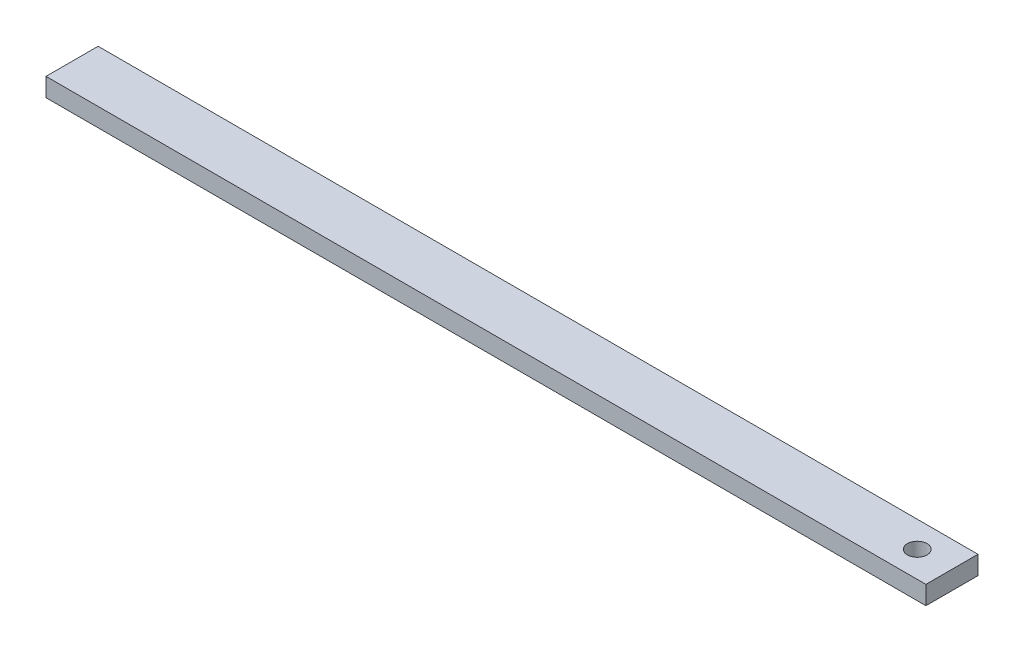
ISO-10303-21;
HEADER;
FILE_DESCRIPTION(('STEP AP214'),'2;1');
FILE_NAME('part.step','',(''),(''),'','','');
FILE_SCHEMA(('AUTOMOTIVE_DESIGN { 1 0 10303 214 1 1 1 1 }'));
ENDSEC;
DATA;
#1=APPLICATION_CONTEXT('core data for automotive mechanical design processes');
#2=APPLICATION_PROTOCOL_DEFINITION('international standard','automotive_design',2000,#1);
#3=PRODUCT_CONTEXT('',#1,'mechanical');
#4=PRODUCT('Part','Part','',(#3));
#5=PRODUCT_RELATED_PRODUCT_CATEGORY('part','',(#4));
#6=PRODUCT_DEFINITION_FORMATION('','',#4);
#7=PRODUCT_DEFINITION_CONTEXT('part definition',#1,'design');
#8=PRODUCT_DEFINITION('design','',#6,#7);
#9=PRODUCT_DEFINITION_SHAPE('','',#8);
#10=(LENGTH_UNIT() NAMED_UNIT(*) SI_UNIT(.MILLI.,.METRE.));
#11=(NAMED_UNIT(*) PLANE_ANGLE_UNIT() SI_UNIT($,.RADIAN.));
#12=(NAMED_UNIT(*) SI_UNIT($,.STERADIAN.) SOLID_ANGLE_UNIT());
#13=UNCERTAINTY_MEASURE_WITH_UNIT(LENGTH_MEASURE(1.E-05),#10,'distance_accuracy_value','');
#14=(GEOMETRIC_REPRESENTATION_CONTEXT(3) GLOBAL_UNCERTAINTY_ASSIGNED_CONTEXT((#13)) GLOBAL_UNIT_ASSIGNED_CONTEXT((#10,
#11,#12)) REPRESENTATION_CONTEXT('',''));
#15=CARTESIAN_POINT('',(0.,0.,0.));
#16=DIRECTION('',(0.,0.,1.));
#17=DIRECTION('',(1.,0.,0.));
#18=AXIS2_PLACEMENT_3D('',#15,#16,#17);
#19=CARTESIAN_POINT('',(0.,0.700000000000017,0.));
#20=DIRECTION('',(-1.,0.,0.));
#21=DIRECTION('',(0.,0.,1.));
#22=AXIS2_PLACEMENT_3D('',#19,#20,#21);
#23=PLANE('',#22);
#24=DIRECTION('',(0.,-1.,0.));
#25=VECTOR('',#24,1.);
#26=CARTESIAN_POINT('',(0.,0.,4.5));
#27=LINE('',#26,#25);
#28=CARTESIAN_POINT('',(0.,0.700000000000051,4.5));
#29=VERTEX_POINT('',#28);
#30=CARTESIAN_POINT('',(0.,-2.49999999999991,4.5));
#31=VERTEX_POINT('',#30);
#32=EDGE_CURVE('E95',#29,#31,#27,.T.);
#33=ORIENTED_EDGE('',*,*,#32,.F.);
#34=DIRECTION('',(0.,0.,1.));
#35=VECTOR('',#34,1.);
#36=CARTESIAN_POINT('',(0.,0.700000000000051,-4.5));
#37=LINE('',#36,#35);
#38=CARTESIAN_POINT('',(0.,0.700000000000051,-4.5));
#39=VERTEX_POINT('',#38);
#40=EDGE_CURVE('E94',#39,#29,#37,.T.);
#41=ORIENTED_EDGE('',*,*,#40,.F.);
#42=DIRECTION('',(0.,-1.,0.));
#43=VECTOR('',#42,1.);
#44=CARTESIAN_POINT('',(0.,0.,-4.5));
#45=LINE('',#44,#43);
#46=CARTESIAN_POINT('',(0.,-2.49999999999991,-4.5));
#47=VERTEX_POINT('',#46);
#48=EDGE_CURVE('E98',#39,#47,#45,.T.);
#49=ORIENTED_EDGE('',*,*,#48,.T.);
#50=DIRECTION('',(0.,0.,-1.));
#51=VECTOR('',#50,1.);
#52=CARTESIAN_POINT('',(0.,-2.49999999999991,-4.5));
#53=LINE('',#52,#51);
#54=EDGE_CURVE('E82',#31,#47,#53,.T.);
#55=ORIENTED_EDGE('',*,*,#54,.F.);
#56=EDGE_LOOP('',(#33,#41,#49,#55));
#57=FACE_BOUND('',#56,.T.);
#58=ADVANCED_FACE('F44',(#57),#23,.T.);
#59=CARTESIAN_POINT('',(152.,2.5,-4.5));
#60=DIRECTION('',(1.,0.,0.));
#61=DIRECTION('',(0.,0.,-1.));
#62=AXIS2_PLACEMENT_3D('',#59,#60,#61);
#63=PLANE('',#62);
#64=DIRECTION('',(0.,0.,1.));
#65=VECTOR('',#64,1.);
#66=CARTESIAN_POINT('',(152.,0.700000000000017,-4.5));
#67=LINE('',#66,#65);
#68=CARTESIAN_POINT('',(152.,0.700000000000017,-4.5));
#69=VERTEX_POINT('',#68);
#70=CARTESIAN_POINT('',(152.,0.700000000000017,4.5));
#71=VERTEX_POINT('',#70);
#72=EDGE_CURVE('E116',#69,#71,#67,.T.);
#73=ORIENTED_EDGE('',*,*,#72,.T.);
#74=DIRECTION('',(0.,1.,0.));
#75=VECTOR('',#74,1.);
#76=CARTESIAN_POINT('',(152.,2.5,4.5));
#77=LINE('',#76,#75);
#78=CARTESIAN_POINT('',(152.,-2.49999999999991,4.5));
#79=VERTEX_POINT('',#78);
#80=EDGE_CURVE('E107',#79,#71,#77,.T.);
#81=ORIENTED_EDGE('',*,*,#80,.F.);
#82=DIRECTION('',(0.,0.,1.));
#83=VECTOR('',#82,1.);
#84=CARTESIAN_POINT('',(152.,-2.49999999999991,-4.5));
#85=LINE('',#84,#83);
#86=CARTESIAN_POINT('',(152.,-2.49999999999991,-4.5));
#87=VERTEX_POINT('',#86);
#88=EDGE_CURVE('E111',#87,#79,#85,.T.);
#89=ORIENTED_EDGE('',*,*,#88,.F.);
#90=DIRECTION('',(0.,1.,0.));
#91=VECTOR('',#90,1.);
#92=CARTESIAN_POINT('',(152.,2.5,-4.5));
#93=LINE('',#92,#91);
#94=EDGE_CURVE('E106',#87,#69,#93,.T.);
#95=ORIENTED_EDGE('',*,*,#94,.T.);
#96=EDGE_LOOP('',(#73,#81,#89,#95));
#97=FACE_BOUND('',#96,.T.);
#98=ADVANCED_FACE('F130',(#97),#63,.T.);
#99=CARTESIAN_POINT('',(0.,0.,4.5));
#100=DIRECTION('',(0.,0.,1.));
#101=DIRECTION('',(1.,0.,0.));
#102=AXIS2_PLACEMENT_3D('',#99,#100,#101);
#103=PLANE('',#102);
#104=DIRECTION('',(-1.,0.,0.));
#105=VECTOR('',#104,1.);
#106=CARTESIAN_POINT('',(108.070787283489,0.700000000000095,4.5));
#107=LINE('',#106,#105);
#108=EDGE_CURVE('E48',#71,#29,#107,.T.);
#109=ORIENTED_EDGE('',*,*,#108,.T.);
#110=ORIENTED_EDGE('',*,*,#32,.T.);
#111=DIRECTION('',(1.,0.,0.));
#112=VECTOR('',#111,1.);
#113=CARTESIAN_POINT('',(-152.,-2.49999999999991,4.5));
#114=LINE('',#113,#112);
#115=EDGE_CURVE('E89',#31,#79,#114,.T.);
#116=ORIENTED_EDGE('',*,*,#115,.T.);
#117=ORIENTED_EDGE('',*,*,#80,.T.);
#118=EDGE_LOOP('',(#109,#110,#116,#117));
#119=FACE_BOUND('',#118,.T.);
#120=ADVANCED_FACE('F128',(#119),#103,.T.);
#121=CARTESIAN_POINT('',(0.,0.,-4.5));
#122=DIRECTION('',(0.,0.,1.));
#123=DIRECTION('',(1.,0.,0.));
#124=AXIS2_PLACEMENT_3D('',#121,#122,#123);
#125=PLANE('',#124);
#126=ORIENTED_EDGE('',*,*,#48,.F.);
#127=DIRECTION('',(-1.,0.,0.));
#128=VECTOR('',#127,1.);
#129=CARTESIAN_POINT('',(108.070787283489,0.700000000000095,-4.5));
#130=LINE('',#129,#128);
#131=EDGE_CURVE('E115',#69,#39,#130,.T.);
#132=ORIENTED_EDGE('',*,*,#131,.F.);
#133=ORIENTED_EDGE('',*,*,#94,.F.);
#134=DIRECTION('',(1.,0.,0.));
#135=VECTOR('',#134,1.);
#136=CARTESIAN_POINT('',(-152.,-2.49999999999991,-4.5));
#137=LINE('',#136,#135);
#138=EDGE_CURVE('E87',#47,#87,#137,.T.);
#139=ORIENTED_EDGE('',*,*,#138,.F.);
#140=EDGE_LOOP('',(#126,#132,#133,#139));
#141=FACE_BOUND('',#140,.T.);
#142=ADVANCED_FACE('F104',(#141),#125,.F.);
#143=CARTESIAN_POINT('',(146.,0.700000000000056,0.));
#144=DIRECTION('',(0.,1.,0.));
#145=DIRECTION('',(0.,0.,1.));
#146=AXIS2_PLACEMENT_3D('',#143,#144,#145);
#147=CYLINDRICAL_SURFACE('',#146,1.70000000000001);
#148=CARTESIAN_POINT('',(146.,0.700000000000056,0.));
#149=DIRECTION('',(0.,1.,0.));
#150=DIRECTION('',(0.,0.,1.));
#151=AXIS2_PLACEMENT_3D('',#148,#149,#150);
#152=CIRCLE('',#151,1.70000000000001);
#153=CARTESIAN_POINT('',(146.,0.700000000000056,1.70000000000001));
#154=VERTEX_POINT('',#153);
#155=EDGE_CURVE('E11',#154,#154,#152,.T.);
#156=ORIENTED_EDGE('',*,*,#155,.T.);
#157=EDGE_LOOP('',(#156));
#158=FACE_BOUND('',#157,.T.);
#159=CARTESIAN_POINT('',(146.,-2.49999999999991,0.));
#160=DIRECTION('',(0.,-1.,0.));
#161=DIRECTION('',(0.,0.,-1.));
#162=AXIS2_PLACEMENT_3D('',#159,#160,#161);
#163=CIRCLE('',#162,1.70000000000001);
#164=CARTESIAN_POINT('',(146.,-2.49999999999991,-1.70000000000001));
#165=VERTEX_POINT('',#164);
#166=EDGE_CURVE('E54',#165,#165,#163,.T.);
#167=ORIENTED_EDGE('',*,*,#166,.T.);
#168=EDGE_LOOP('',(#167));
#169=FACE_BOUND('',#168,.T.);
#170=ADVANCED_FACE('F140',(#158,#169),#147,.F.);
#171=CARTESIAN_POINT('',(108.070787283489,0.700000000000095,-4.5));
#172=DIRECTION('',(0.,1.,0.));
#173=DIRECTION('',(-1.,0.,0.));
#174=AXIS2_PLACEMENT_3D('',#171,#172,#173);
#175=PLANE('',#174);
#176=ORIENTED_EDGE('',*,*,#155,.F.);
#177=EDGE_LOOP('',(#176));
#178=FACE_BOUND('',#177,.T.);
#179=ORIENTED_EDGE('',*,*,#131,.T.);
#180=ORIENTED_EDGE('',*,*,#40,.T.);
#181=ORIENTED_EDGE('',*,*,#108,.F.);
#182=ORIENTED_EDGE('',*,*,#72,.F.);
#183=EDGE_LOOP('',(#179,#180,#181,#182));
#184=FACE_BOUND('',#183,.T.);
#185=ADVANCED_FACE('F46',(#178,#184),#175,.T.);
#186=CARTESIAN_POINT('',(-152.,-2.49999999999991,-4.5));
#187=DIRECTION('',(0.,-1.,0.));
#188=DIRECTION('',(0.,0.,-1.));
#189=AXIS2_PLACEMENT_3D('',#186,#187,#188);
#190=PLANE('',#189);
#191=ORIENTED_EDGE('',*,*,#166,.F.);
#192=EDGE_LOOP('',(#191));
#193=FACE_BOUND('',#192,.T.);
#194=ORIENTED_EDGE('',*,*,#115,.F.);
#195=ORIENTED_EDGE('',*,*,#54,.T.);
#196=ORIENTED_EDGE('',*,*,#138,.T.);
#197=ORIENTED_EDGE('',*,*,#88,.T.);
#198=EDGE_LOOP('',(#194,#195,#196,#197));
#199=FACE_BOUND('',#198,.T.);
#200=ADVANCED_FACE('F84',(#193,#199),#190,.T.);
#201=CLOSED_SHELL('',(#58,#98,#120,#142,#170,#185,#200));
#202=MANIFOLD_SOLID_BREP('B2',#201);
#203=ADVANCED_BREP_SHAPE_REPRESENTATION('',(#18,#202),#14);
#204=SHAPE_DEFINITION_REPRESENTATION(#9,#203);
ENDSEC;
END-ISO-10303-21;
